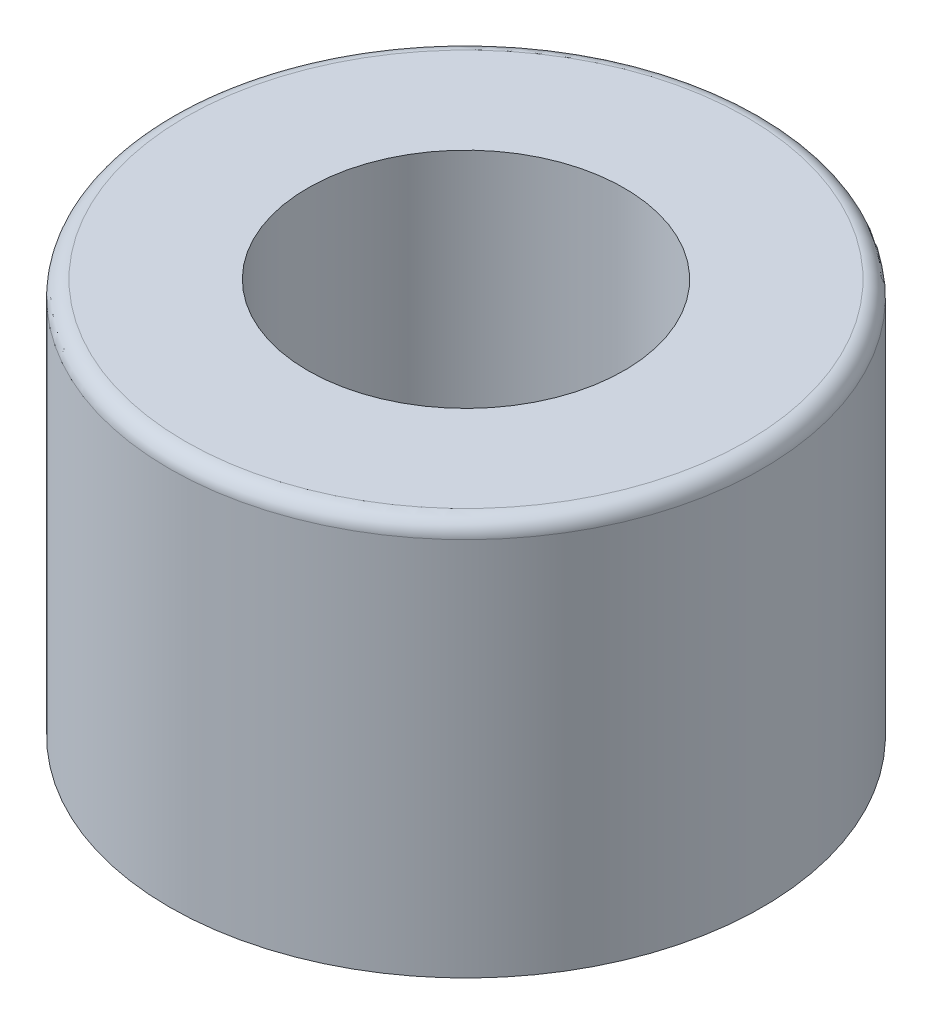
ISO-10303-21;
HEADER;
FILE_DESCRIPTION(('STEP AP214'),'2;1');
FILE_NAME('part.step','',(''),(''),'','','');
FILE_SCHEMA(('AUTOMOTIVE_DESIGN { 1 0 10303 214 1 1 1 1 }'));
ENDSEC;
DATA;
#1=APPLICATION_CONTEXT('core data for automotive mechanical design processes');
#2=APPLICATION_PROTOCOL_DEFINITION('international standard','automotive_design',2000,#1);
#3=PRODUCT_CONTEXT('',#1,'mechanical');
#4=PRODUCT('Part','Part','',(#3));
#5=PRODUCT_RELATED_PRODUCT_CATEGORY('part','',(#4));
#6=PRODUCT_DEFINITION_FORMATION('','',#4);
#7=PRODUCT_DEFINITION_CONTEXT('part definition',#1,'design');
#8=PRODUCT_DEFINITION('design','',#6,#7);
#9=PRODUCT_DEFINITION_SHAPE('','',#8);
#10=(LENGTH_UNIT() NAMED_UNIT(*) SI_UNIT(.MILLI.,.METRE.));
#11=(NAMED_UNIT(*) PLANE_ANGLE_UNIT() SI_UNIT($,.RADIAN.));
#12=(NAMED_UNIT(*) SI_UNIT($,.STERADIAN.) SOLID_ANGLE_UNIT());
#13=UNCERTAINTY_MEASURE_WITH_UNIT(LENGTH_MEASURE(1.E-05),#10,'distance_accuracy_value','');
#14=(GEOMETRIC_REPRESENTATION_CONTEXT(3) GLOBAL_UNCERTAINTY_ASSIGNED_CONTEXT((#13)) GLOBAL_UNIT_ASSIGNED_CONTEXT((#10,
#11,#12)) REPRESENTATION_CONTEXT('',''));
#15=CARTESIAN_POINT('',(0.,0.,0.));
#16=DIRECTION('',(0.,0.,1.));
#17=DIRECTION('',(1.,0.,0.));
#18=AXIS2_PLACEMENT_3D('',#15,#16,#17);
#19=CARTESIAN_POINT('',(0.,6.35,0.));
#20=DIRECTION('',(0.,1.,0.));
#21=DIRECTION('',(0.,0.,1.));
#22=AXIS2_PLACEMENT_3D('',#19,#20,#21);
#23=PLANE('',#22);
#24=CARTESIAN_POINT('',(0.,6.35,0.));
#25=DIRECTION('',(0.,1.,0.));
#26=DIRECTION('',(0.,0.,1.));
#27=AXIS2_PLACEMENT_3D('',#24,#25,#26);
#28=CIRCLE('',#27,4.5085);
#29=CARTESIAN_POINT('',(0.,6.35,4.5085));
#30=VERTEX_POINT('',#29);
#31=EDGE_CURVE('E39',#30,#30,#28,.T.);
#32=ORIENTED_EDGE('',*,*,#31,.T.);
#33=EDGE_LOOP('',(#32));
#34=FACE_BOUND('',#33,.T.);
#35=CARTESIAN_POINT('',(0.,6.35,0.));
#36=DIRECTION('',(0.,1.,0.));
#37=DIRECTION('',(0.,0.,1.));
#38=AXIS2_PLACEMENT_3D('',#35,#36,#37);
#39=CIRCLE('',#38,2.54);
#40=CARTESIAN_POINT('',(0.,6.35,2.54));
#41=VERTEX_POINT('',#40);
#42=EDGE_CURVE('E47',#41,#41,#39,.T.);
#43=ORIENTED_EDGE('',*,*,#42,.F.);
#44=EDGE_LOOP('',(#43));
#45=FACE_BOUND('',#44,.T.);
#46=ADVANCED_FACE('F32',(#34,#45),#23,.T.);
#47=CARTESIAN_POINT('',(0.,0.,0.));
#48=DIRECTION('',(0.,1.,0.));
#49=DIRECTION('',(0.,0.,1.));
#50=AXIS2_PLACEMENT_3D('',#47,#48,#49);
#51=PLANE('',#50);
#52=CARTESIAN_POINT('',(0.,0.,0.));
#53=DIRECTION('',(0.,1.,0.));
#54=DIRECTION('',(0.,0.,1.));
#55=AXIS2_PLACEMENT_3D('',#52,#53,#54);
#56=CIRCLE('',#55,4.7625);
#57=CARTESIAN_POINT('',(0.,0.,4.7625));
#58=VERTEX_POINT('',#57);
#59=EDGE_CURVE('E43',#58,#58,#56,.T.);
#60=ORIENTED_EDGE('',*,*,#59,.F.);
#61=EDGE_LOOP('',(#60));
#62=FACE_BOUND('',#61,.T.);
#63=CARTESIAN_POINT('',(0.,0.,0.));
#64=DIRECTION('',(0.,1.,0.));
#65=DIRECTION('',(0.,0.,1.));
#66=AXIS2_PLACEMENT_3D('',#63,#64,#65);
#67=CIRCLE('',#66,2.54);
#68=CARTESIAN_POINT('',(0.,0.,2.54));
#69=VERTEX_POINT('',#68);
#70=EDGE_CURVE('E50',#69,#69,#67,.T.);
#71=ORIENTED_EDGE('',*,*,#70,.T.);
#72=EDGE_LOOP('',(#71));
#73=FACE_BOUND('',#72,.T.);
#74=ADVANCED_FACE('F60',(#62,#73),#51,.F.);
#75=CARTESIAN_POINT('',(0.,6.35,0.));
#76=DIRECTION('',(0.,-1.,0.));
#77=DIRECTION('',(0.,0.,-1.));
#78=AXIS2_PLACEMENT_3D('',#75,#76,#77);
#79=CYLINDRICAL_SURFACE('',#78,4.7625);
#80=CARTESIAN_POINT('',(0.,6.096,0.));
#81=DIRECTION('',(0.,1.,0.));
#82=DIRECTION('',(0.,0.,1.));
#83=AXIS2_PLACEMENT_3D('',#80,#81,#82);
#84=CIRCLE('',#83,4.7625);
#85=CARTESIAN_POINT('',(0.,6.096,4.7625));
#86=VERTEX_POINT('',#85);
#87=EDGE_CURVE('E10',#86,#86,#84,.F.);
#88=ORIENTED_EDGE('',*,*,#87,.T.);
#89=EDGE_LOOP('',(#88));
#90=FACE_BOUND('',#89,.T.);
#91=ORIENTED_EDGE('',*,*,#59,.T.);
#92=EDGE_LOOP('',(#91));
#93=FACE_BOUND('',#92,.T.);
#94=ADVANCED_FACE('F65',(#90,#93),#79,.T.);
#95=CARTESIAN_POINT('',(0.,6.35,0.));
#96=DIRECTION('',(0.,-1.,0.));
#97=DIRECTION('',(0.,0.,-1.));
#98=AXIS2_PLACEMENT_3D('',#95,#96,#97);
#99=CYLINDRICAL_SURFACE('',#98,2.54);
#100=ORIENTED_EDGE('',*,*,#42,.T.);
#101=EDGE_LOOP('',(#100));
#102=FACE_BOUND('',#101,.T.);
#103=ORIENTED_EDGE('',*,*,#70,.F.);
#104=EDGE_LOOP('',(#103));
#105=FACE_BOUND('',#104,.T.);
#106=ADVANCED_FACE('F56',(#102,#105),#99,.F.);
#107=CARTESIAN_POINT('',(0.,6.096,0.));
#108=DIRECTION('',(0.,1.,0.));
#109=DIRECTION('',(0.,0.,1.));
#110=AXIS2_PLACEMENT_3D('',#107,#108,#109);
#111=TOROIDAL_SURFACE('',#110,4.5085,0.254);
#112=ORIENTED_EDGE('',*,*,#87,.F.);
#113=EDGE_LOOP('',(#112));
#114=FACE_BOUND('',#113,.T.);
#115=ORIENTED_EDGE('',*,*,#31,.F.);
#116=EDGE_LOOP('',(#115));
#117=FACE_BOUND('',#116,.T.);
#118=ADVANCED_FACE('F34',(#114,#117),#111,.T.);
#119=CLOSED_SHELL('',(#46,#74,#94,#106,#118));
#120=MANIFOLD_SOLID_BREP('B2',#119);
#121=ADVANCED_BREP_SHAPE_REPRESENTATION('',(#18,#120),#14);
#122=SHAPE_DEFINITION_REPRESENTATION(#9,#121);
ENDSEC;
END-ISO-10303-21;
